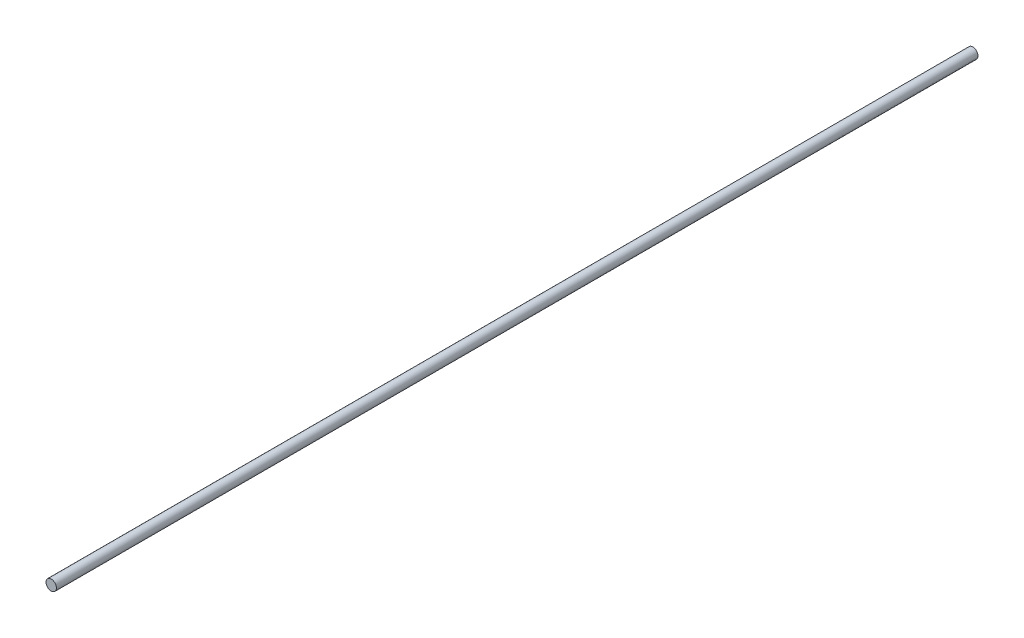
ISO-10303-21;
HEADER;
FILE_DESCRIPTION(('STEP AP214'),'2;1');
FILE_NAME('part.step','',(''),(''),'','','');
FILE_SCHEMA(('AUTOMOTIVE_DESIGN { 1 0 10303 214 1 1 1 1 }'));
ENDSEC;
DATA;
#1=APPLICATION_CONTEXT('core data for automotive mechanical design processes');
#2=APPLICATION_PROTOCOL_DEFINITION('international standard','automotive_design',2000,#1);
#3=PRODUCT_CONTEXT('',#1,'mechanical');
#4=PRODUCT('Part','Part','',(#3));
#5=PRODUCT_RELATED_PRODUCT_CATEGORY('part','',(#4));
#6=PRODUCT_DEFINITION_FORMATION('','',#4);
#7=PRODUCT_DEFINITION_CONTEXT('part definition',#1,'design');
#8=PRODUCT_DEFINITION('design','',#6,#7);
#9=PRODUCT_DEFINITION_SHAPE('','',#8);
#10=(LENGTH_UNIT() NAMED_UNIT(*) SI_UNIT(.MILLI.,.METRE.));
#11=(NAMED_UNIT(*) PLANE_ANGLE_UNIT() SI_UNIT($,.RADIAN.));
#12=(NAMED_UNIT(*) SI_UNIT($,.STERADIAN.) SOLID_ANGLE_UNIT());
#13=UNCERTAINTY_MEASURE_WITH_UNIT(LENGTH_MEASURE(1.E-05),#10,'distance_accuracy_value','');
#14=(GEOMETRIC_REPRESENTATION_CONTEXT(3) GLOBAL_UNCERTAINTY_ASSIGNED_CONTEXT((#13)) GLOBAL_UNIT_ASSIGNED_CONTEXT((#10,
#11,#12)) REPRESENTATION_CONTEXT('',''));
#15=CARTESIAN_POINT('',(0.,0.,0.));
#16=DIRECTION('',(0.,0.,1.));
#17=DIRECTION('',(1.,0.,0.));
#18=AXIS2_PLACEMENT_3D('',#15,#16,#17);
#19=CARTESIAN_POINT('',(0.,0.0450858550355674,1122.172));
#20=DIRECTION('',(0.,0.,-1.));
#21=DIRECTION('',(-1.,0.,0.));
#22=AXIS2_PLACEMENT_3D('',#19,#20,#21);
#23=CYLINDRICAL_SURFACE('',#22,6.35);
#24=CARTESIAN_POINT('',(0.,0.0450858550355674,1122.172));
#25=DIRECTION('',(0.,0.,1.));
#26=DIRECTION('',(1.,0.,0.));
#27=AXIS2_PLACEMENT_3D('',#24,#25,#26);
#28=CIRCLE('',#27,6.35);
#29=CARTESIAN_POINT('',(6.35,0.0450858550355674,1122.172));
#30=VERTEX_POINT('',#29);
#31=EDGE_CURVE('E10',#30,#30,#28,.T.);
#32=ORIENTED_EDGE('',*,*,#31,.F.);
#33=EDGE_LOOP('',(#32));
#34=FACE_BOUND('',#33,.T.);
#35=CARTESIAN_POINT('',(0.,0.0450858550355674,0.));
#36=DIRECTION('',(0.,0.,1.));
#37=DIRECTION('',(1.,0.,0.));
#38=AXIS2_PLACEMENT_3D('',#35,#36,#37);
#39=CIRCLE('',#38,6.35);
#40=CARTESIAN_POINT('',(6.35,0.0450858550355674,0.));
#41=VERTEX_POINT('',#40);
#42=EDGE_CURVE('E46',#41,#41,#39,.T.);
#43=ORIENTED_EDGE('',*,*,#42,.T.);
#44=EDGE_LOOP('',(#43));
#45=FACE_BOUND('',#44,.T.);
#46=ADVANCED_FACE('F43',(#34,#45),#23,.T.);
#47=CARTESIAN_POINT('',(0.,0.0450858550355674,1122.172));
#48=DIRECTION('',(0.,0.,1.));
#49=DIRECTION('',(1.,0.,0.));
#50=AXIS2_PLACEMENT_3D('',#47,#48,#49);
#51=PLANE('',#50);
#52=ORIENTED_EDGE('',*,*,#31,.T.);
#53=EDGE_LOOP('',(#52));
#54=FACE_BOUND('',#53,.T.);
#55=ADVANCED_FACE('F59',(#54),#51,.T.);
#56=CARTESIAN_POINT('',(0.,0.0450858550355674,0.));
#57=DIRECTION('',(0.,0.,1.));
#58=DIRECTION('',(1.,0.,0.));
#59=AXIS2_PLACEMENT_3D('',#56,#57,#58);
#60=PLANE('',#59);
#61=ORIENTED_EDGE('',*,*,#42,.F.);
#62=EDGE_LOOP('',(#61));
#63=FACE_BOUND('',#62,.T.);
#64=ADVANCED_FACE('F57',(#63),#60,.F.);
#65=CLOSED_SHELL('',(#46,#55,#64));
#66=MANIFOLD_SOLID_BREP('B2',#65);
#67=ADVANCED_BREP_SHAPE_REPRESENTATION('',(#18,#66),#14);
#68=SHAPE_DEFINITION_REPRESENTATION(#9,#67);
ENDSEC;
END-ISO-10303-21;
